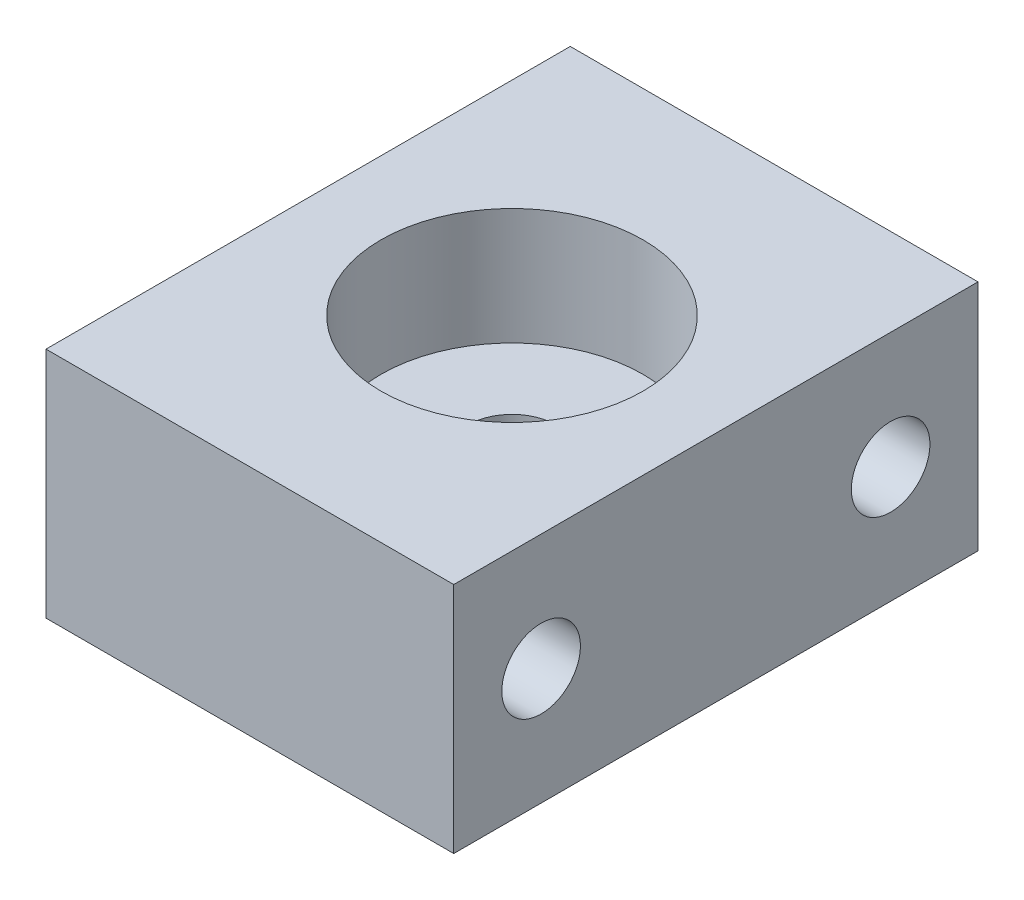
ISO-10303-21;
HEADER;
FILE_DESCRIPTION(('STEP AP214'),'2;1');
FILE_NAME('part.step','',(''),(''),'','','');
FILE_SCHEMA(('AUTOMOTIVE_DESIGN { 1 0 10303 214 1 1 1 1 }'));
ENDSEC;
DATA;
#1=APPLICATION_CONTEXT('core data for automotive mechanical design processes');
#2=APPLICATION_PROTOCOL_DEFINITION('international standard','automotive_design',2000,#1);
#3=PRODUCT_CONTEXT('',#1,'mechanical');
#4=PRODUCT('Part','Part','',(#3));
#5=PRODUCT_RELATED_PRODUCT_CATEGORY('part','',(#4));
#6=PRODUCT_DEFINITION_FORMATION('','',#4);
#7=PRODUCT_DEFINITION_CONTEXT('part definition',#1,'design');
#8=PRODUCT_DEFINITION('design','',#6,#7);
#9=PRODUCT_DEFINITION_SHAPE('','',#8);
#10=(LENGTH_UNIT() NAMED_UNIT(*) SI_UNIT(.MILLI.,.METRE.));
#11=(NAMED_UNIT(*) PLANE_ANGLE_UNIT() SI_UNIT($,.RADIAN.));
#12=(NAMED_UNIT(*) SI_UNIT($,.STERADIAN.) SOLID_ANGLE_UNIT());
#13=UNCERTAINTY_MEASURE_WITH_UNIT(LENGTH_MEASURE(1.E-05),#10,'distance_accuracy_value','');
#14=(GEOMETRIC_REPRESENTATION_CONTEXT(3) GLOBAL_UNCERTAINTY_ASSIGNED_CONTEXT((#13)) GLOBAL_UNIT_ASSIGNED_CONTEXT((#10,
#11,#12)) REPRESENTATION_CONTEXT('',''));
#15=CARTESIAN_POINT('',(0.,0.,0.));
#16=DIRECTION('',(0.,0.,1.));
#17=DIRECTION('',(1.,0.,0.));
#18=AXIS2_PLACEMENT_3D('',#15,#16,#17);
#19=CARTESIAN_POINT('',(-7.,0.,5.99999999999651));
#20=DIRECTION('',(1.,0.,0.));
#21=DIRECTION('',(0.,0.,-1.));
#22=AXIS2_PLACEMENT_3D('',#19,#20,#21);
#23=CYLINDRICAL_SURFACE('',#22,1.35);
#24=CARTESIAN_POINT('',(-7.,0.,5.99999999999651));
#25=DIRECTION('',(1.,0.,0.));
#26=DIRECTION('',(0.,0.,-1.));
#27=AXIS2_PLACEMENT_3D('',#24,#25,#26);
#28=CIRCLE('',#27,1.35);
#29=CARTESIAN_POINT('',(-7.,0.,4.64999999999651));
#30=VERTEX_POINT('',#29);
#31=EDGE_CURVE('E150',#30,#30,#28,.T.);
#32=ORIENTED_EDGE('',*,*,#31,.F.);
#33=EDGE_LOOP('',(#32));
#34=FACE_BOUND('',#33,.T.);
#35=CARTESIAN_POINT('',(-3.,0.,5.99999999999651));
#36=DIRECTION('',(1.,0.,0.));
#37=DIRECTION('',(0.,0.,-1.));
#38=AXIS2_PLACEMENT_3D('',#35,#36,#37);
#39=CIRCLE('',#38,1.35);
#40=CARTESIAN_POINT('',(-3.,0.,4.64999999999651));
#41=VERTEX_POINT('',#40);
#42=EDGE_CURVE('E11',#41,#41,#39,.F.);
#43=ORIENTED_EDGE('',*,*,#42,.F.);
#44=EDGE_LOOP('',(#43));
#45=FACE_BOUND('',#44,.T.);
#46=ADVANCED_FACE('F35',(#34,#45),#23,.F.);
#47=CARTESIAN_POINT('',(-7.,0.,-6.00000000000349));
#48=DIRECTION('',(1.,0.,0.));
#49=DIRECTION('',(0.,0.,-1.));
#50=AXIS2_PLACEMENT_3D('',#47,#48,#49);
#51=CYLINDRICAL_SURFACE('',#50,1.35);
#52=CARTESIAN_POINT('',(-7.,0.,-6.00000000000349));
#53=DIRECTION('',(1.,0.,0.));
#54=DIRECTION('',(0.,0.,-1.));
#55=AXIS2_PLACEMENT_3D('',#52,#53,#54);
#56=CIRCLE('',#55,1.35);
#57=CARTESIAN_POINT('',(-7.,0.,-7.35000000000349));
#58=VERTEX_POINT('',#57);
#59=EDGE_CURVE('E107',#58,#58,#56,.T.);
#60=ORIENTED_EDGE('',*,*,#59,.F.);
#61=EDGE_LOOP('',(#60));
#62=FACE_BOUND('',#61,.T.);
#63=CARTESIAN_POINT('',(-3.,0.,-6.00000000000349));
#64=DIRECTION('',(1.,0.,0.));
#65=DIRECTION('',(0.,0.,-1.));
#66=AXIS2_PLACEMENT_3D('',#63,#64,#65);
#67=CIRCLE('',#66,1.35);
#68=CARTESIAN_POINT('',(-3.,0.,-7.35000000000349));
#69=VERTEX_POINT('',#68);
#70=EDGE_CURVE('E45',#69,#69,#67,.F.);
#71=ORIENTED_EDGE('',*,*,#70,.F.);
#72=EDGE_LOOP('',(#71));
#73=FACE_BOUND('',#72,.T.);
#74=ADVANCED_FACE('F119',(#62,#73),#51,.F.);
#75=CARTESIAN_POINT('',(7.,-4.,9.));
#76=DIRECTION('',(-1.,0.,0.));
#77=DIRECTION('',(0.,0.,1.));
#78=AXIS2_PLACEMENT_3D('',#75,#76,#77);
#79=PLANE('',#78);
#80=CARTESIAN_POINT('',(7.,0.,-6.00000000000349));
#81=DIRECTION('',(1.,0.,0.));
#82=DIRECTION('',(0.,0.,-1.));
#83=AXIS2_PLACEMENT_3D('',#80,#81,#82);
#84=CIRCLE('',#83,1.35);
#85=CARTESIAN_POINT('',(7.,0.,-7.35000000000349));
#86=VERTEX_POINT('',#85);
#87=EDGE_CURVE('E149',#86,#86,#84,.T.);
#88=ORIENTED_EDGE('',*,*,#87,.F.);
#89=EDGE_LOOP('',(#88));
#90=FACE_BOUND('',#89,.T.);
#91=CARTESIAN_POINT('',(7.,0.,5.99999999999651));
#92=DIRECTION('',(1.,0.,0.));
#93=DIRECTION('',(0.,0.,-1.));
#94=AXIS2_PLACEMENT_3D('',#91,#92,#93);
#95=CIRCLE('',#94,1.35);
#96=CARTESIAN_POINT('',(7.,0.,4.64999999999651));
#97=VERTEX_POINT('',#96);
#98=EDGE_CURVE('E155',#97,#97,#95,.T.);
#99=ORIENTED_EDGE('',*,*,#98,.F.);
#100=EDGE_LOOP('',(#99));
#101=FACE_BOUND('',#100,.T.);
#102=DIRECTION('',(0.,1.,0.));
#103=VECTOR('',#102,1.);
#104=CARTESIAN_POINT('',(7.,-4.,-9.));
#105=LINE('',#104,#103);
#106=CARTESIAN_POINT('',(7.,-4.,-9.));
#107=VERTEX_POINT('',#106);
#108=CARTESIAN_POINT('',(7.,4.,-9.));
#109=VERTEX_POINT('',#108);
#110=EDGE_CURVE('E104',#107,#109,#105,.T.);
#111=ORIENTED_EDGE('',*,*,#110,.T.);
#112=DIRECTION('',(0.,0.,-1.));
#113=VECTOR('',#112,1.);
#114=CARTESIAN_POINT('',(7.,4.,9.));
#115=LINE('',#114,#113);
#116=CARTESIAN_POINT('',(7.,4.,9.));
#117=VERTEX_POINT('',#116);
#118=EDGE_CURVE('E95',#117,#109,#115,.T.);
#119=ORIENTED_EDGE('',*,*,#118,.F.);
#120=DIRECTION('',(0.,1.,0.));
#121=VECTOR('',#120,1.);
#122=CARTESIAN_POINT('',(7.,-4.,9.));
#123=LINE('',#122,#121);
#124=CARTESIAN_POINT('',(7.,-4.,9.));
#125=VERTEX_POINT('',#124);
#126=EDGE_CURVE('E89',#125,#117,#123,.T.);
#127=ORIENTED_EDGE('',*,*,#126,.F.);
#128=DIRECTION('',(0.,0.,-1.));
#129=VECTOR('',#128,1.);
#130=CARTESIAN_POINT('',(7.,-4.,9.));
#131=LINE('',#130,#129);
#132=EDGE_CURVE('E100',#125,#107,#131,.T.);
#133=ORIENTED_EDGE('',*,*,#132,.T.);
#134=EDGE_LOOP('',(#111,#119,#127,#133));
#135=FACE_BOUND('',#134,.T.);
#136=ADVANCED_FACE('F37',(#90,#101,#135),#79,.F.);
#137=CARTESIAN_POINT('',(-7.,4.,9.));
#138=DIRECTION('',(0.,-1.,0.));
#139=DIRECTION('',(0.,0.,-1.));
#140=AXIS2_PLACEMENT_3D('',#137,#138,#139);
#141=PLANE('',#140);
#142=CARTESIAN_POINT('',(0.,4.,0.));
#143=DIRECTION('',(0.,-1.,0.));
#144=DIRECTION('',(0.,0.,-1.));
#145=AXIS2_PLACEMENT_3D('',#142,#143,#144);
#146=CIRCLE('',#145,4.5);
#147=CARTESIAN_POINT('',(0.,4.,-4.5));
#148=VERTEX_POINT('',#147);
#149=EDGE_CURVE('E172',#148,#148,#146,.T.);
#150=ORIENTED_EDGE('',*,*,#149,.T.);
#151=EDGE_LOOP('',(#150));
#152=FACE_BOUND('',#151,.T.);
#153=DIRECTION('',(-1.,0.,0.));
#154=VECTOR('',#153,1.);
#155=CARTESIAN_POINT('',(-7.,4.,-9.));
#156=LINE('',#155,#154);
#157=CARTESIAN_POINT('',(-7.,4.,-9.));
#158=VERTEX_POINT('',#157);
#159=EDGE_CURVE('E94',#109,#158,#156,.T.);
#160=ORIENTED_EDGE('',*,*,#159,.T.);
#161=DIRECTION('',(0.,0.,-1.));
#162=VECTOR('',#161,1.);
#163=CARTESIAN_POINT('',(-7.,4.,9.));
#164=LINE('',#163,#162);
#165=CARTESIAN_POINT('',(-7.,4.,9.));
#166=VERTEX_POINT('',#165);
#167=EDGE_CURVE('E92',#166,#158,#164,.T.);
#168=ORIENTED_EDGE('',*,*,#167,.F.);
#169=DIRECTION('',(-1.,0.,0.));
#170=VECTOR('',#169,1.);
#171=CARTESIAN_POINT('',(-7.,4.,9.));
#172=LINE('',#171,#170);
#173=EDGE_CURVE('E84',#117,#166,#172,.T.);
#174=ORIENTED_EDGE('',*,*,#173,.F.);
#175=ORIENTED_EDGE('',*,*,#118,.T.);
#176=EDGE_LOOP('',(#160,#168,#174,#175));
#177=FACE_BOUND('',#176,.T.);
#178=ADVANCED_FACE('F93',(#152,#177),#141,.F.);
#179=CARTESIAN_POINT('',(-7.,-4.,9.));
#180=DIRECTION('',(1.,0.,0.));
#181=DIRECTION('',(0.,0.,-1.));
#182=AXIS2_PLACEMENT_3D('',#179,#180,#181);
#183=PLANE('',#182);
#184=ORIENTED_EDGE('',*,*,#59,.T.);
#185=EDGE_LOOP('',(#184));
#186=FACE_BOUND('',#185,.T.);
#187=ORIENTED_EDGE('',*,*,#31,.T.);
#188=EDGE_LOOP('',(#187));
#189=FACE_BOUND('',#188,.T.);
#190=DIRECTION('',(0.,-1.,0.));
#191=VECTOR('',#190,1.);
#192=CARTESIAN_POINT('',(-7.,-4.,-9.));
#193=LINE('',#192,#191);
#194=CARTESIAN_POINT('',(-7.,-4.,-9.));
#195=VERTEX_POINT('',#194);
#196=EDGE_CURVE('E70',#158,#195,#193,.T.);
#197=ORIENTED_EDGE('',*,*,#196,.T.);
#198=DIRECTION('',(0.,0.,-1.));
#199=VECTOR('',#198,1.);
#200=CARTESIAN_POINT('',(-7.,-4.,9.));
#201=LINE('',#200,#199);
#202=CARTESIAN_POINT('',(-7.,-4.,9.));
#203=VERTEX_POINT('',#202);
#204=EDGE_CURVE('E96',#203,#195,#201,.T.);
#205=ORIENTED_EDGE('',*,*,#204,.F.);
#206=DIRECTION('',(0.,-1.,0.));
#207=VECTOR('',#206,1.);
#208=CARTESIAN_POINT('',(-7.,-4.,9.));
#209=LINE('',#208,#207);
#210=EDGE_CURVE('E87',#166,#203,#209,.T.);
#211=ORIENTED_EDGE('',*,*,#210,.F.);
#212=ORIENTED_EDGE('',*,*,#167,.T.);
#213=EDGE_LOOP('',(#197,#205,#211,#212));
#214=FACE_BOUND('',#213,.T.);
#215=ADVANCED_FACE('F98',(#186,#189,#214),#183,.F.);
#216=CARTESIAN_POINT('',(-7.,-4.,9.));
#217=DIRECTION('',(0.,1.,0.));
#218=DIRECTION('',(0.,0.,1.));
#219=AXIS2_PLACEMENT_3D('',#216,#217,#218);
#220=PLANE('',#219);
#221=CARTESIAN_POINT('',(0.,-4.,0.));
#222=DIRECTION('',(0.,-1.,0.));
#223=DIRECTION('',(0.,0.,-1.));
#224=AXIS2_PLACEMENT_3D('',#221,#222,#223);
#225=CIRCLE('',#224,1.5);
#226=CARTESIAN_POINT('',(0.,-4.,-1.5));
#227=VERTEX_POINT('',#226);
#228=EDGE_CURVE('E166',#227,#227,#225,.T.);
#229=ORIENTED_EDGE('',*,*,#228,.F.);
#230=EDGE_LOOP('',(#229));
#231=FACE_BOUND('',#230,.T.);
#232=DIRECTION('',(1.,0.,0.));
#233=VECTOR('',#232,1.);
#234=CARTESIAN_POINT('',(-7.,-4.,-9.));
#235=LINE('',#234,#233);
#236=EDGE_CURVE('E76',#195,#107,#235,.T.);
#237=ORIENTED_EDGE('',*,*,#236,.T.);
#238=ORIENTED_EDGE('',*,*,#132,.F.);
#239=DIRECTION('',(1.,0.,0.));
#240=VECTOR('',#239,1.);
#241=CARTESIAN_POINT('',(-7.,-4.,9.));
#242=LINE('',#241,#240);
#243=EDGE_CURVE('E53',#203,#125,#242,.T.);
#244=ORIENTED_EDGE('',*,*,#243,.F.);
#245=ORIENTED_EDGE('',*,*,#204,.T.);
#246=EDGE_LOOP('',(#237,#238,#244,#245));
#247=FACE_BOUND('',#246,.T.);
#248=ADVANCED_FACE('F243',(#231,#247),#220,.F.);
#249=CARTESIAN_POINT('',(0.,0.,9.));
#250=DIRECTION('',(0.,0.,-1.));
#251=DIRECTION('',(-1.,0.,0.));
#252=AXIS2_PLACEMENT_3D('',#249,#250,#251);
#253=PLANE('',#252);
#254=ORIENTED_EDGE('',*,*,#126,.T.);
#255=ORIENTED_EDGE('',*,*,#173,.T.);
#256=ORIENTED_EDGE('',*,*,#210,.T.);
#257=ORIENTED_EDGE('',*,*,#243,.T.);
#258=EDGE_LOOP('',(#254,#255,#256,#257));
#259=FACE_BOUND('',#258,.T.);
#260=ADVANCED_FACE('F85',(#259),#253,.F.);
#261=CARTESIAN_POINT('',(0.,0.,-9.));
#262=DIRECTION('',(0.,0.,-1.));
#263=DIRECTION('',(-1.,0.,0.));
#264=AXIS2_PLACEMENT_3D('',#261,#262,#263);
#265=PLANE('',#264);
#266=ORIENTED_EDGE('',*,*,#110,.F.);
#267=ORIENTED_EDGE('',*,*,#236,.F.);
#268=ORIENTED_EDGE('',*,*,#196,.F.);
#269=ORIENTED_EDGE('',*,*,#159,.F.);
#270=EDGE_LOOP('',(#266,#267,#268,#269));
#271=FACE_BOUND('',#270,.T.);
#272=ADVANCED_FACE('F141',(#271),#265,.T.);
#273=CARTESIAN_POINT('',(3.,0.,5.99999999999651));
#274=DIRECTION('',(1.,0.,0.));
#275=DIRECTION('',(0.,0.,-1.));
#276=AXIS2_PLACEMENT_3D('',#273,#274,#275);
#277=CIRCLE('',#276,1.35);
#278=CARTESIAN_POINT('',(3.,0.,4.64999999999651));
#279=VERTEX_POINT('',#278);
#280=EDGE_CURVE('E163',#279,#279,#277,.T.);
#281=ORIENTED_EDGE('',*,*,#280,.F.);
#282=EDGE_LOOP('',(#281));
#283=FACE_BOUND('',#282,.T.);
#284=ORIENTED_EDGE('',*,*,#98,.T.);
#285=EDGE_LOOP('',(#284));
#286=FACE_BOUND('',#285,.T.);
#287=ADVANCED_FACE('F131',(#283,#286),#23,.F.);
#288=CARTESIAN_POINT('',(3.,0.,-6.00000000000349));
#289=DIRECTION('',(1.,0.,0.));
#290=DIRECTION('',(0.,0.,-1.));
#291=AXIS2_PLACEMENT_3D('',#288,#289,#290);
#292=CIRCLE('',#291,1.35);
#293=CARTESIAN_POINT('',(3.,0.,-7.35000000000349));
#294=VERTEX_POINT('',#293);
#295=EDGE_CURVE('E146',#294,#294,#292,.T.);
#296=ORIENTED_EDGE('',*,*,#295,.F.);
#297=EDGE_LOOP('',(#296));
#298=FACE_BOUND('',#297,.T.);
#299=ORIENTED_EDGE('',*,*,#87,.T.);
#300=EDGE_LOOP('',(#299));
#301=FACE_BOUND('',#300,.T.);
#302=ADVANCED_FACE('F123',(#298,#301),#51,.F.);
#303=CARTESIAN_POINT('',(-3.,0.,-6.00000000000349));
#304=DIRECTION('',(1.,0.,0.));
#305=DIRECTION('',(0.,0.,-1.));
#306=AXIS2_PLACEMENT_3D('',#303,#304,#305);
#307=PLANE('',#306);
#308=ORIENTED_EDGE('',*,*,#70,.T.);
#309=EDGE_LOOP('',(#308));
#310=FACE_BOUND('',#309,.T.);
#311=ADVANCED_FACE('F117',(#310),#307,.F.);
#312=CARTESIAN_POINT('',(3.,0.,-6.00000000000349));
#313=DIRECTION('',(1.,0.,0.));
#314=DIRECTION('',(0.,0.,-1.));
#315=AXIS2_PLACEMENT_3D('',#312,#313,#314);
#316=PLANE('',#315);
#317=ORIENTED_EDGE('',*,*,#295,.T.);
#318=EDGE_LOOP('',(#317));
#319=FACE_BOUND('',#318,.T.);
#320=ADVANCED_FACE('F140',(#319),#316,.T.);
#321=CARTESIAN_POINT('',(-3.,0.,5.99999999999651));
#322=DIRECTION('',(1.,0.,0.));
#323=DIRECTION('',(0.,0.,-1.));
#324=AXIS2_PLACEMENT_3D('',#321,#322,#323);
#325=PLANE('',#324);
#326=ORIENTED_EDGE('',*,*,#42,.T.);
#327=EDGE_LOOP('',(#326));
#328=FACE_BOUND('',#327,.T.);
#329=ADVANCED_FACE('F201',(#328),#325,.F.);
#330=CARTESIAN_POINT('',(3.,0.,5.99999999999651));
#331=DIRECTION('',(1.,0.,0.));
#332=DIRECTION('',(0.,0.,-1.));
#333=AXIS2_PLACEMENT_3D('',#330,#331,#332);
#334=PLANE('',#333);
#335=ORIENTED_EDGE('',*,*,#280,.T.);
#336=EDGE_LOOP('',(#335));
#337=FACE_BOUND('',#336,.T.);
#338=ADVANCED_FACE('F196',(#337),#334,.T.);
#339=CARTESIAN_POINT('',(0.,6.,0.));
#340=DIRECTION('',(0.,-1.,0.));
#341=DIRECTION('',(0.,0.,-1.));
#342=AXIS2_PLACEMENT_3D('',#339,#340,#341);
#343=CYLINDRICAL_SURFACE('',#342,1.5);
#344=CARTESIAN_POINT('',(0.,0.,0.));
#345=DIRECTION('',(0.,-1.,0.));
#346=DIRECTION('',(0.,0.,-1.));
#347=AXIS2_PLACEMENT_3D('',#344,#345,#346);
#348=CIRCLE('',#347,1.5);
#349=CARTESIAN_POINT('',(0.,0.,-1.5));
#350=VERTEX_POINT('',#349);
#351=EDGE_CURVE('E39',#350,#350,#348,.F.);
#352=ORIENTED_EDGE('',*,*,#351,.T.);
#353=EDGE_LOOP('',(#352));
#354=FACE_BOUND('',#353,.T.);
#355=ORIENTED_EDGE('',*,*,#228,.T.);
#356=EDGE_LOOP('',(#355));
#357=FACE_BOUND('',#356,.T.);
#358=ADVANCED_FACE('F182',(#354,#357),#343,.F.);
#359=CARTESIAN_POINT('',(0.,0.,0.));
#360=DIRECTION('',(0.,-1.,0.));
#361=DIRECTION('',(0.,0.,-1.));
#362=AXIS2_PLACEMENT_3D('',#359,#360,#361);
#363=PLANE('',#362);
#364=CARTESIAN_POINT('',(0.,0.,0.));
#365=DIRECTION('',(0.,-1.,0.));
#366=DIRECTION('',(0.,0.,-1.));
#367=AXIS2_PLACEMENT_3D('',#364,#365,#366);
#368=CIRCLE('',#367,4.5);
#369=CARTESIAN_POINT('',(0.,0.,-4.5));
#370=VERTEX_POINT('',#369);
#371=EDGE_CURVE('E175',#370,#370,#368,.T.);
#372=ORIENTED_EDGE('',*,*,#371,.F.);
#373=EDGE_LOOP('',(#372));
#374=FACE_BOUND('',#373,.T.);
#375=ORIENTED_EDGE('',*,*,#351,.F.);
#376=EDGE_LOOP('',(#375));
#377=FACE_BOUND('',#376,.T.);
#378=ADVANCED_FACE('F185',(#374,#377),#363,.F.);
#379=CARTESIAN_POINT('',(0.,0.,0.));
#380=DIRECTION('',(0.,1.,0.));
#381=DIRECTION('',(0.,0.,1.));
#382=AXIS2_PLACEMENT_3D('',#379,#380,#381);
#383=CYLINDRICAL_SURFACE('',#382,4.5);
#384=ORIENTED_EDGE('',*,*,#371,.T.);
#385=EDGE_LOOP('',(#384));
#386=FACE_BOUND('',#385,.T.);
#387=ORIENTED_EDGE('',*,*,#149,.F.);
#388=EDGE_LOOP('',(#387));
#389=FACE_BOUND('',#388,.T.);
#390=ADVANCED_FACE('F187',(#386,#389),#383,.F.);
#391=CLOSED_SHELL('',(#46,#74,#136,#178,#215,#248,#260,#272,#287,#302,#311,#320,#329,#338,#358,
#378,#390));
#392=MANIFOLD_SOLID_BREP('B2',#391);
#393=ADVANCED_BREP_SHAPE_REPRESENTATION('',(#18,#392),#14);
#394=SHAPE_DEFINITION_REPRESENTATION(#9,#393);
ENDSEC;
END-ISO-10303-21;
